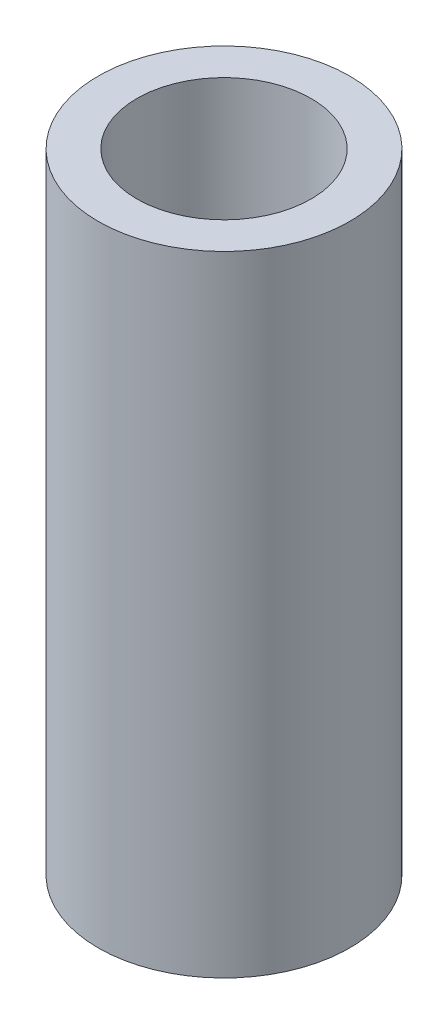
ISO-10303-21;
HEADER;
FILE_DESCRIPTION(('STEP AP214'),'2;1');
FILE_NAME('part.step','',(''),(''),'','','');
FILE_SCHEMA(('AUTOMOTIVE_DESIGN { 1 0 10303 214 1 1 1 1 }'));
ENDSEC;
DATA;
#1=APPLICATION_CONTEXT('core data for automotive mechanical design processes');
#2=APPLICATION_PROTOCOL_DEFINITION('international standard','automotive_design',2000,#1);
#3=PRODUCT_CONTEXT('',#1,'mechanical');
#4=PRODUCT('Part','Part','',(#3));
#5=PRODUCT_RELATED_PRODUCT_CATEGORY('part','',(#4));
#6=PRODUCT_DEFINITION_FORMATION('','',#4);
#7=PRODUCT_DEFINITION_CONTEXT('part definition',#1,'design');
#8=PRODUCT_DEFINITION('design','',#6,#7);
#9=PRODUCT_DEFINITION_SHAPE('','',#8);
#10=(LENGTH_UNIT() NAMED_UNIT(*) SI_UNIT(.MILLI.,.METRE.));
#11=(NAMED_UNIT(*) PLANE_ANGLE_UNIT() SI_UNIT($,.RADIAN.));
#12=(NAMED_UNIT(*) SI_UNIT($,.STERADIAN.) SOLID_ANGLE_UNIT());
#13=UNCERTAINTY_MEASURE_WITH_UNIT(LENGTH_MEASURE(1.E-05),#10,'distance_accuracy_value','');
#14=(GEOMETRIC_REPRESENTATION_CONTEXT(3) GLOBAL_UNCERTAINTY_ASSIGNED_CONTEXT((#13)) GLOBAL_UNIT_ASSIGNED_CONTEXT((#10,
#11,#12)) REPRESENTATION_CONTEXT('',''));
#15=CARTESIAN_POINT('',(0.,0.,0.));
#16=DIRECTION('',(0.,0.,1.));
#17=DIRECTION('',(1.,0.,0.));
#18=AXIS2_PLACEMENT_3D('',#15,#16,#17);
#19=CARTESIAN_POINT('',(0.,32.5,0.));
#20=DIRECTION('',(0.,1.,0.));
#21=DIRECTION('',(0.,0.,1.));
#22=AXIS2_PLACEMENT_3D('',#19,#20,#21);
#23=PLANE('',#22);
#24=CARTESIAN_POINT('',(0.,32.5,0.));
#25=DIRECTION('',(0.,1.,0.));
#26=DIRECTION('',(0.,0.,1.));
#27=AXIS2_PLACEMENT_3D('',#24,#25,#26);
#28=CIRCLE('',#27,6.5);
#29=CARTESIAN_POINT('',(0.,32.5,6.5));
#30=VERTEX_POINT('',#29);
#31=EDGE_CURVE('E10',#30,#30,#28,.T.);
#32=ORIENTED_EDGE('',*,*,#31,.T.);
#33=EDGE_LOOP('',(#32));
#34=FACE_BOUND('',#33,.T.);
#35=CARTESIAN_POINT('',(0.,32.5,0.));
#36=DIRECTION('',(0.,1.,0.));
#37=DIRECTION('',(0.,0.,1.));
#38=AXIS2_PLACEMENT_3D('',#35,#36,#37);
#39=CIRCLE('',#38,4.5);
#40=CARTESIAN_POINT('',(0.,32.5,4.5));
#41=VERTEX_POINT('',#40);
#42=EDGE_CURVE('E42',#41,#41,#39,.T.);
#43=ORIENTED_EDGE('',*,*,#42,.F.);
#44=EDGE_LOOP('',(#43));
#45=FACE_BOUND('',#44,.T.);
#46=ADVANCED_FACE('F31',(#34,#45),#23,.T.);
#47=CARTESIAN_POINT('',(0.,0.,0.));
#48=DIRECTION('',(0.,1.,0.));
#49=DIRECTION('',(0.,0.,1.));
#50=AXIS2_PLACEMENT_3D('',#47,#48,#49);
#51=PLANE('',#50);
#52=CARTESIAN_POINT('',(0.,0.,0.));
#53=DIRECTION('',(0.,1.,0.));
#54=DIRECTION('',(0.,0.,1.));
#55=AXIS2_PLACEMENT_3D('',#52,#53,#54);
#56=CIRCLE('',#55,6.5);
#57=CARTESIAN_POINT('',(0.,0.,6.5));
#58=VERTEX_POINT('',#57);
#59=EDGE_CURVE('E35',#58,#58,#56,.T.);
#60=ORIENTED_EDGE('',*,*,#59,.F.);
#61=EDGE_LOOP('',(#60));
#62=FACE_BOUND('',#61,.T.);
#63=CARTESIAN_POINT('',(0.,0.,0.));
#64=DIRECTION('',(0.,1.,0.));
#65=DIRECTION('',(0.,0.,1.));
#66=AXIS2_PLACEMENT_3D('',#63,#64,#65);
#67=CIRCLE('',#66,4.5);
#68=CARTESIAN_POINT('',(0.,0.,4.5));
#69=VERTEX_POINT('',#68);
#70=EDGE_CURVE('E44',#69,#69,#67,.T.);
#71=ORIENTED_EDGE('',*,*,#70,.T.);
#72=EDGE_LOOP('',(#71));
#73=FACE_BOUND('',#72,.T.);
#74=ADVANCED_FACE('F54',(#62,#73),#51,.F.);
#75=CARTESIAN_POINT('',(0.,32.5,0.));
#76=DIRECTION('',(0.,-1.,0.));
#77=DIRECTION('',(0.,0.,-1.));
#78=AXIS2_PLACEMENT_3D('',#75,#76,#77);
#79=CYLINDRICAL_SURFACE('',#78,6.5);
#80=ORIENTED_EDGE('',*,*,#31,.F.);
#81=EDGE_LOOP('',(#80));
#82=FACE_BOUND('',#81,.T.);
#83=ORIENTED_EDGE('',*,*,#59,.T.);
#84=EDGE_LOOP('',(#83));
#85=FACE_BOUND('',#84,.T.);
#86=ADVANCED_FACE('F33',(#82,#85),#79,.T.);
#87=CARTESIAN_POINT('',(0.,32.5,0.));
#88=DIRECTION('',(0.,-1.,0.));
#89=DIRECTION('',(0.,0.,-1.));
#90=AXIS2_PLACEMENT_3D('',#87,#88,#89);
#91=CYLINDRICAL_SURFACE('',#90,4.5);
#92=ORIENTED_EDGE('',*,*,#42,.T.);
#93=EDGE_LOOP('',(#92));
#94=FACE_BOUND('',#93,.T.);
#95=ORIENTED_EDGE('',*,*,#70,.F.);
#96=EDGE_LOOP('',(#95));
#97=FACE_BOUND('',#96,.T.);
#98=ADVANCED_FACE('F50',(#94,#97),#91,.F.);
#99=CLOSED_SHELL('',(#46,#74,#86,#98));
#100=MANIFOLD_SOLID_BREP('B2',#99);
#101=ADVANCED_BREP_SHAPE_REPRESENTATION('',(#18,#100),#14);
#102=SHAPE_DEFINITION_REPRESENTATION(#9,#101);
ENDSEC;
END-ISO-10303-21;
